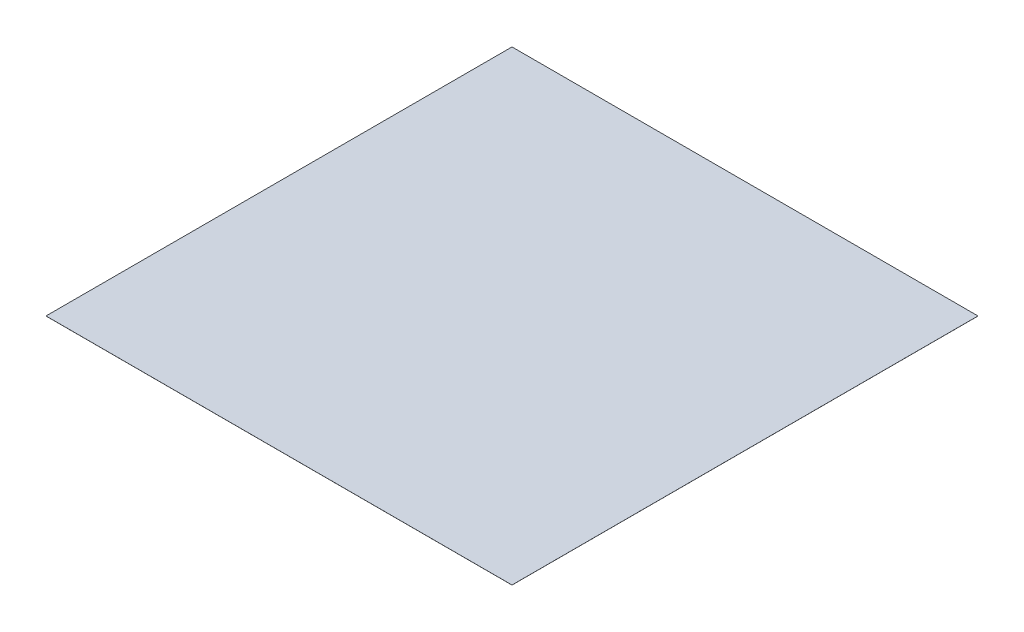
ISO-10303-21;
HEADER;
FILE_DESCRIPTION(('STEP AP214'),'2;1');
FILE_NAME('part.step','',(''),(''),'','','');
FILE_SCHEMA(('AUTOMOTIVE_DESIGN { 1 0 10303 214 1 1 1 1 }'));
ENDSEC;
DATA;
#1=APPLICATION_CONTEXT('core data for automotive mechanical design processes');
#2=APPLICATION_PROTOCOL_DEFINITION('international standard','automotive_design',2000,#1);
#3=PRODUCT_CONTEXT('',#1,'mechanical');
#4=PRODUCT('Part','Part','',(#3));
#5=PRODUCT_RELATED_PRODUCT_CATEGORY('part','',(#4));
#6=PRODUCT_DEFINITION_FORMATION('','',#4);
#7=PRODUCT_DEFINITION_CONTEXT('part definition',#1,'design');
#8=PRODUCT_DEFINITION('design','',#6,#7);
#9=PRODUCT_DEFINITION_SHAPE('','',#8);
#10=(LENGTH_UNIT() NAMED_UNIT(*) SI_UNIT(.MILLI.,.METRE.));
#11=(NAMED_UNIT(*) PLANE_ANGLE_UNIT() SI_UNIT($,.RADIAN.));
#12=(NAMED_UNIT(*) SI_UNIT($,.STERADIAN.) SOLID_ANGLE_UNIT());
#13=UNCERTAINTY_MEASURE_WITH_UNIT(LENGTH_MEASURE(1.E-05),#10,'distance_accuracy_value','');
#14=(GEOMETRIC_REPRESENTATION_CONTEXT(3) GLOBAL_UNCERTAINTY_ASSIGNED_CONTEXT((#13)) GLOBAL_UNIT_ASSIGNED_CONTEXT((#10,
#11,#12)) REPRESENTATION_CONTEXT('',''));
#15=CARTESIAN_POINT('',(0.,0.,0.));
#16=DIRECTION('',(0.,0.,1.));
#17=DIRECTION('',(1.,0.,0.));
#18=AXIS2_PLACEMENT_3D('',#15,#16,#17);
#19=CARTESIAN_POINT('',(0.,0.01,0.));
#20=DIRECTION('',(1.,0.,0.));
#21=DIRECTION('',(0.,0.,-1.));
#22=AXIS2_PLACEMENT_3D('',#19,#20,#21);
#23=PLANE('',#22);
#24=DIRECTION('',(0.,0.,1.));
#25=VECTOR('',#24,1.);
#26=CARTESIAN_POINT('',(0.,0.,0.));
#27=LINE('',#26,#25);
#28=CARTESIAN_POINT('',(0.,0.,-65.));
#29=VERTEX_POINT('',#28);
#30=CARTESIAN_POINT('',(0.,0.,0.));
#31=VERTEX_POINT('',#30);
#32=EDGE_CURVE('E115',#29,#31,#27,.T.);
#33=ORIENTED_EDGE('',*,*,#32,.T.);
#34=DIRECTION('',(0.,-1.,0.));
#35=VECTOR('',#34,1.);
#36=CARTESIAN_POINT('',(0.,0.01,0.));
#37=LINE('',#36,#35);
#38=CARTESIAN_POINT('',(0.,0.01,0.));
#39=VERTEX_POINT('',#38);
#40=EDGE_CURVE('E11',#39,#31,#37,.T.);
#41=ORIENTED_EDGE('',*,*,#40,.F.);
#42=DIRECTION('',(0.,0.,1.));
#43=VECTOR('',#42,1.);
#44=CARTESIAN_POINT('',(0.,0.01,0.));
#45=LINE('',#44,#43);
#46=CARTESIAN_POINT('',(0.,0.01,-65.));
#47=VERTEX_POINT('',#46);
#48=EDGE_CURVE('E98',#47,#39,#45,.T.);
#49=ORIENTED_EDGE('',*,*,#48,.F.);
#50=DIRECTION('',(0.,-1.,0.));
#51=VECTOR('',#50,1.);
#52=CARTESIAN_POINT('',(0.,0.01,-65.));
#53=LINE('',#52,#51);
#54=EDGE_CURVE('E111',#47,#29,#53,.T.);
#55=ORIENTED_EDGE('',*,*,#54,.T.);
#56=EDGE_LOOP('',(#33,#41,#49,#55));
#57=FACE_BOUND('',#56,.T.);
#58=ADVANCED_FACE('F38',(#57),#23,.F.);
#59=CARTESIAN_POINT('',(0.,0.01,0.));
#60=DIRECTION('',(0.,0.,-1.));
#61=DIRECTION('',(-1.,0.,0.));
#62=AXIS2_PLACEMENT_3D('',#59,#60,#61);
#63=PLANE('',#62);
#64=DIRECTION('',(1.,0.,0.));
#65=VECTOR('',#64,1.);
#66=CARTESIAN_POINT('',(0.,0.,0.));
#67=LINE('',#66,#65);
#68=CARTESIAN_POINT('',(65.,0.,0.));
#69=VERTEX_POINT('',#68);
#70=EDGE_CURVE('E103',#31,#69,#67,.T.);
#71=ORIENTED_EDGE('',*,*,#70,.T.);
#72=DIRECTION('',(0.,-1.,0.));
#73=VECTOR('',#72,1.);
#74=CARTESIAN_POINT('',(65.,0.01,0.));
#75=LINE('',#74,#73);
#76=CARTESIAN_POINT('',(65.,0.01,0.));
#77=VERTEX_POINT('',#76);
#78=EDGE_CURVE('E47',#77,#69,#75,.T.);
#79=ORIENTED_EDGE('',*,*,#78,.F.);
#80=DIRECTION('',(1.,0.,0.));
#81=VECTOR('',#80,1.);
#82=CARTESIAN_POINT('',(0.,0.01,0.));
#83=LINE('',#82,#81);
#84=EDGE_CURVE('E93',#39,#77,#83,.T.);
#85=ORIENTED_EDGE('',*,*,#84,.F.);
#86=ORIENTED_EDGE('',*,*,#40,.T.);
#87=EDGE_LOOP('',(#71,#79,#85,#86));
#88=FACE_BOUND('',#87,.T.);
#89=ADVANCED_FACE('F102',(#88),#63,.F.);
#90=CARTESIAN_POINT('',(65.,0.01,0.));
#91=DIRECTION('',(-1.,0.,0.));
#92=DIRECTION('',(0.,0.,1.));
#93=AXIS2_PLACEMENT_3D('',#90,#91,#92);
#94=PLANE('',#93);
#95=DIRECTION('',(0.,0.,-1.));
#96=VECTOR('',#95,1.);
#97=CARTESIAN_POINT('',(65.,0.,0.));
#98=LINE('',#97,#96);
#99=CARTESIAN_POINT('',(65.,0.,-65.));
#100=VERTEX_POINT('',#99);
#101=EDGE_CURVE('E78',#69,#100,#98,.T.);
#102=ORIENTED_EDGE('',*,*,#101,.T.);
#103=DIRECTION('',(0.,-1.,0.));
#104=VECTOR('',#103,1.);
#105=CARTESIAN_POINT('',(65.,0.01,-65.));
#106=LINE('',#105,#104);
#107=CARTESIAN_POINT('',(65.,0.01,-65.));
#108=VERTEX_POINT('',#107);
#109=EDGE_CURVE('E105',#108,#100,#106,.T.);
#110=ORIENTED_EDGE('',*,*,#109,.F.);
#111=DIRECTION('',(0.,0.,-1.));
#112=VECTOR('',#111,1.);
#113=CARTESIAN_POINT('',(65.,0.01,0.));
#114=LINE('',#113,#112);
#115=EDGE_CURVE('E96',#77,#108,#114,.T.);
#116=ORIENTED_EDGE('',*,*,#115,.F.);
#117=ORIENTED_EDGE('',*,*,#78,.T.);
#118=EDGE_LOOP('',(#102,#110,#116,#117));
#119=FACE_BOUND('',#118,.T.);
#120=ADVANCED_FACE('F106',(#119),#94,.F.);
#121=CARTESIAN_POINT('',(0.,0.01,-65.));
#122=DIRECTION('',(0.,0.,1.));
#123=DIRECTION('',(1.,0.,0.));
#124=AXIS2_PLACEMENT_3D('',#121,#122,#123);
#125=PLANE('',#124);
#126=DIRECTION('',(-1.,0.,0.));
#127=VECTOR('',#126,1.);
#128=CARTESIAN_POINT('',(0.,0.,-65.));
#129=LINE('',#128,#127);
#130=EDGE_CURVE('E84',#100,#29,#129,.T.);
#131=ORIENTED_EDGE('',*,*,#130,.T.);
#132=ORIENTED_EDGE('',*,*,#54,.F.);
#133=DIRECTION('',(-1.,0.,0.));
#134=VECTOR('',#133,1.);
#135=CARTESIAN_POINT('',(0.,0.01,-65.));
#136=LINE('',#135,#134);
#137=EDGE_CURVE('E57',#108,#47,#136,.T.);
#138=ORIENTED_EDGE('',*,*,#137,.F.);
#139=ORIENTED_EDGE('',*,*,#109,.T.);
#140=EDGE_LOOP('',(#131,#132,#138,#139));
#141=FACE_BOUND('',#140,.T.);
#142=ADVANCED_FACE('F127',(#141),#125,.F.);
#143=CARTESIAN_POINT('',(0.,0.01,0.));
#144=DIRECTION('',(0.,-1.,0.));
#145=DIRECTION('',(0.,0.,-1.));
#146=AXIS2_PLACEMENT_3D('',#143,#144,#145);
#147=PLANE('',#146);
#148=ORIENTED_EDGE('',*,*,#48,.T.);
#149=ORIENTED_EDGE('',*,*,#84,.T.);
#150=ORIENTED_EDGE('',*,*,#115,.T.);
#151=ORIENTED_EDGE('',*,*,#137,.T.);
#152=EDGE_LOOP('',(#148,#149,#150,#151));
#153=FACE_BOUND('',#152,.T.);
#154=ADVANCED_FACE('F94',(#153),#147,.F.);
#155=CARTESIAN_POINT('',(0.,0.,0.));
#156=DIRECTION('',(0.,-1.,0.));
#157=DIRECTION('',(0.,0.,-1.));
#158=AXIS2_PLACEMENT_3D('',#155,#156,#157);
#159=PLANE('',#158);
#160=ORIENTED_EDGE('',*,*,#32,.F.);
#161=ORIENTED_EDGE('',*,*,#130,.F.);
#162=ORIENTED_EDGE('',*,*,#101,.F.);
#163=ORIENTED_EDGE('',*,*,#70,.F.);
#164=EDGE_LOOP('',(#160,#161,#162,#163));
#165=FACE_BOUND('',#164,.T.);
#166=ADVANCED_FACE('F130',(#165),#159,.T.);
#167=CLOSED_SHELL('',(#58,#89,#120,#142,#154,#166));
#168=MANIFOLD_SOLID_BREP('B2',#167);
#169=ADVANCED_BREP_SHAPE_REPRESENTATION('',(#18,#168),#14);
#170=SHAPE_DEFINITION_REPRESENTATION(#9,#169);
ENDSEC;
END-ISO-10303-21;
